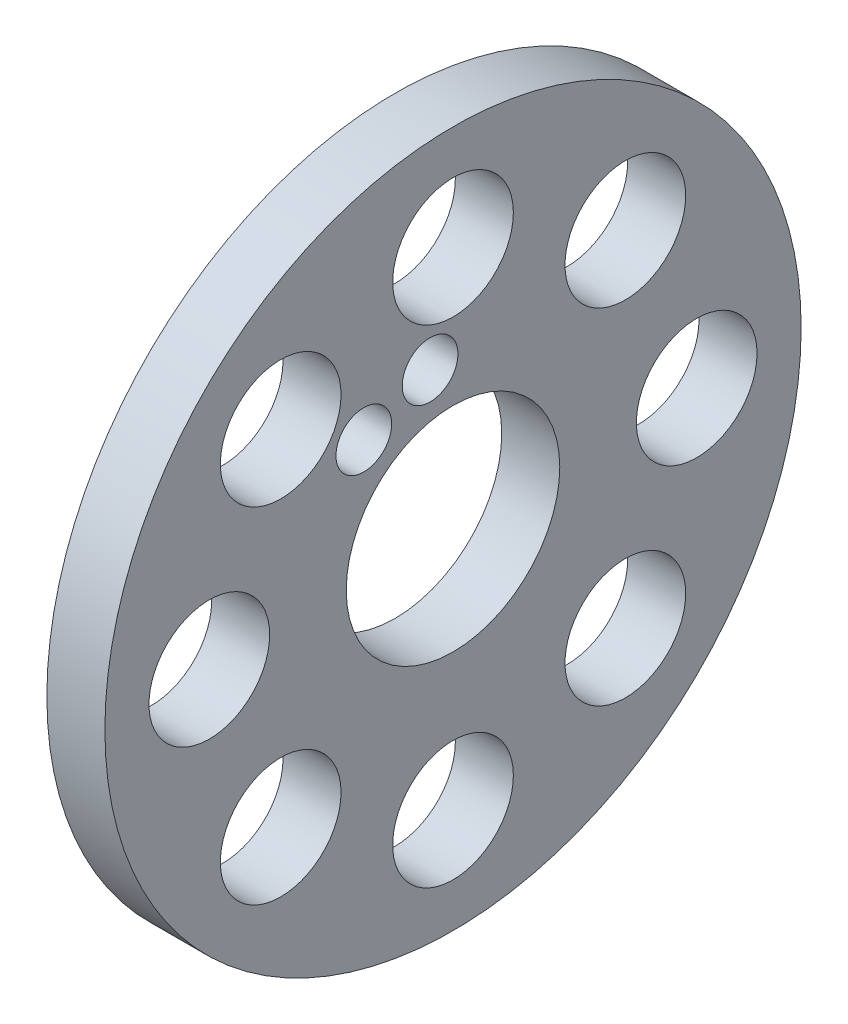
ISO-10303-21;
HEADER;
FILE_DESCRIPTION(('STEP AP214'),'2;1');
FILE_NAME('part.step','',(''),(''),'','','');
FILE_SCHEMA(('AUTOMOTIVE_DESIGN { 1 0 10303 214 1 1 1 1 }'));
ENDSEC;
DATA;
#1=APPLICATION_CONTEXT('core data for automotive mechanical design processes');
#2=APPLICATION_PROTOCOL_DEFINITION('international standard','automotive_design',2000,#1);
#3=PRODUCT_CONTEXT('',#1,'mechanical');
#4=PRODUCT('Part','Part','',(#3));
#5=PRODUCT_RELATED_PRODUCT_CATEGORY('part','',(#4));
#6=PRODUCT_DEFINITION_FORMATION('','',#4);
#7=PRODUCT_DEFINITION_CONTEXT('part definition',#1,'design');
#8=PRODUCT_DEFINITION('design','',#6,#7);
#9=PRODUCT_DEFINITION_SHAPE('','',#8);
#10=(LENGTH_UNIT() NAMED_UNIT(*) SI_UNIT(.MILLI.,.METRE.));
#11=(NAMED_UNIT(*) PLANE_ANGLE_UNIT() SI_UNIT($,.RADIAN.));
#12=(NAMED_UNIT(*) SI_UNIT($,.STERADIAN.) SOLID_ANGLE_UNIT());
#13=UNCERTAINTY_MEASURE_WITH_UNIT(LENGTH_MEASURE(1.E-05),#10,'distance_accuracy_value','');
#14=(GEOMETRIC_REPRESENTATION_CONTEXT(3) GLOBAL_UNCERTAINTY_ASSIGNED_CONTEXT((#13)) GLOBAL_UNIT_ASSIGNED_CONTEXT((#10,
#11,#12)) REPRESENTATION_CONTEXT('',''));
#15=CARTESIAN_POINT('',(0.,0.,0.));
#16=DIRECTION('',(0.,0.,1.));
#17=DIRECTION('',(1.,0.,0.));
#18=AXIS2_PLACEMENT_3D('',#15,#16,#17);
#19=CARTESIAN_POINT('',(143.7,30.,0.));
#20=DIRECTION('',(1.,0.,0.));
#21=DIRECTION('',(0.,0.,-1.));
#22=AXIS2_PLACEMENT_3D('',#19,#20,#21);
#23=PLANE('',#22);
#24=CARTESIAN_POINT('',(143.7,12.8487337040411,1.97738266469541));
#25=DIRECTION('',(1.,0.,0.));
#26=DIRECTION('',(0.,0.,-1.));
#27=AXIS2_PLACEMENT_3D('',#24,#25,#26);
#28=CIRCLE('',#27,2.4);
#29=CARTESIAN_POINT('',(143.7,12.8487337040411,-0.422617335304591));
#30=VERTEX_POINT('',#29);
#31=EDGE_CURVE('E50',#30,#30,#28,.F.);
#32=ORIENTED_EDGE('',*,*,#31,.F.);
#33=EDGE_LOOP('',(#32));
#34=FACE_BOUND('',#33,.T.);
#35=CARTESIAN_POINT('',(143.7,14.8492424049175,-14.8492424049175));
#36=DIRECTION('',(1.,0.,0.));
#37=DIRECTION('',(0.,0.,-1.));
#38=AXIS2_PLACEMENT_3D('',#35,#36,#37);
#39=CIRCLE('',#38,5.2);
#40=CARTESIAN_POINT('',(143.7,14.8492424049175,-20.0492424049175));
#41=VERTEX_POINT('',#40);
#42=EDGE_CURVE('E53',#41,#41,#39,.F.);
#43=ORIENTED_EDGE('',*,*,#42,.F.);
#44=EDGE_LOOP('',(#43));
#45=FACE_BOUND('',#44,.T.);
#46=CARTESIAN_POINT('',(143.7,0.,-21.));
#47=DIRECTION('',(1.,0.,0.));
#48=DIRECTION('',(0.,0.,-1.));
#49=AXIS2_PLACEMENT_3D('',#46,#47,#48);
#50=CIRCLE('',#49,5.2);
#51=CARTESIAN_POINT('',(143.7,0.,-26.2));
#52=VERTEX_POINT('',#51);
#53=EDGE_CURVE('E56',#52,#52,#50,.F.);
#54=ORIENTED_EDGE('',*,*,#53,.F.);
#55=EDGE_LOOP('',(#54));
#56=FACE_BOUND('',#55,.T.);
#57=CARTESIAN_POINT('',(143.7,-14.8492424049175,-14.8492424049175));
#58=DIRECTION('',(1.,0.,0.));
#59=DIRECTION('',(0.,0.,-1.));
#60=AXIS2_PLACEMENT_3D('',#57,#58,#59);
#61=CIRCLE('',#60,5.2);
#62=CARTESIAN_POINT('',(143.7,-14.8492424049175,-20.0492424049175));
#63=VERTEX_POINT('',#62);
#64=EDGE_CURVE('E59',#63,#63,#61,.F.);
#65=ORIENTED_EDGE('',*,*,#64,.F.);
#66=EDGE_LOOP('',(#65));
#67=FACE_BOUND('',#66,.T.);
#68=CARTESIAN_POINT('',(143.7,-21.,0.));
#69=DIRECTION('',(1.,0.,0.));
#70=DIRECTION('',(0.,0.,-1.));
#71=AXIS2_PLACEMENT_3D('',#68,#69,#70);
#72=CIRCLE('',#71,5.2);
#73=CARTESIAN_POINT('',(143.7,-21.,-5.2));
#74=VERTEX_POINT('',#73);
#75=EDGE_CURVE('E62',#74,#74,#72,.F.);
#76=ORIENTED_EDGE('',*,*,#75,.F.);
#77=EDGE_LOOP('',(#76));
#78=FACE_BOUND('',#77,.T.);
#79=CARTESIAN_POINT('',(143.7,-14.8492424049175,14.8492424049175));
#80=DIRECTION('',(1.,0.,0.));
#81=DIRECTION('',(0.,0.,-1.));
#82=AXIS2_PLACEMENT_3D('',#79,#80,#81);
#83=CIRCLE('',#82,5.2);
#84=CARTESIAN_POINT('',(143.7,-14.8492424049175,9.6492424049175));
#85=VERTEX_POINT('',#84);
#86=EDGE_CURVE('E65',#85,#85,#83,.F.);
#87=ORIENTED_EDGE('',*,*,#86,.F.);
#88=EDGE_LOOP('',(#87));
#89=FACE_BOUND('',#88,.T.);
#90=CARTESIAN_POINT('',(143.7,0.,21.));
#91=DIRECTION('',(1.,0.,0.));
#92=DIRECTION('',(0.,0.,-1.));
#93=AXIS2_PLACEMENT_3D('',#90,#91,#92);
#94=CIRCLE('',#93,5.2);
#95=CARTESIAN_POINT('',(143.7,0.,15.8));
#96=VERTEX_POINT('',#95);
#97=EDGE_CURVE('E68',#96,#96,#94,.F.);
#98=ORIENTED_EDGE('',*,*,#97,.F.);
#99=EDGE_LOOP('',(#98));
#100=FACE_BOUND('',#99,.T.);
#101=CARTESIAN_POINT('',(143.7,14.8492424049175,14.8492424049175));
#102=DIRECTION('',(1.,0.,0.));
#103=DIRECTION('',(0.,0.,-1.));
#104=AXIS2_PLACEMENT_3D('',#101,#102,#103);
#105=CIRCLE('',#104,5.2);
#106=CARTESIAN_POINT('',(143.7,14.8492424049175,9.6492424049175));
#107=VERTEX_POINT('',#106);
#108=EDGE_CURVE('E71',#107,#107,#105,.F.);
#109=ORIENTED_EDGE('',*,*,#108,.F.);
#110=EDGE_LOOP('',(#109));
#111=FACE_BOUND('',#110,.T.);
#112=CARTESIAN_POINT('',(143.7,10.4836474229945,7.68720604058077));
#113=DIRECTION('',(1.,0.,0.));
#114=DIRECTION('',(0.,0.,-1.));
#115=AXIS2_PLACEMENT_3D('',#112,#113,#114);
#116=CIRCLE('',#115,2.4);
#117=CARTESIAN_POINT('',(143.7,10.4836474229945,5.28720604058077));
#118=VERTEX_POINT('',#117);
#119=EDGE_CURVE('E74',#118,#118,#116,.F.);
#120=ORIENTED_EDGE('',*,*,#119,.F.);
#121=EDGE_LOOP('',(#120));
#122=FACE_BOUND('',#121,.T.);
#123=CARTESIAN_POINT('',(143.7,21.,0.));
#124=DIRECTION('',(1.,0.,0.));
#125=DIRECTION('',(0.,0.,-1.));
#126=AXIS2_PLACEMENT_3D('',#123,#124,#125);
#127=CIRCLE('',#126,5.2);
#128=CARTESIAN_POINT('',(143.7,21.,-5.2));
#129=VERTEX_POINT('',#128);
#130=EDGE_CURVE('E77',#129,#129,#127,.F.);
#131=ORIENTED_EDGE('',*,*,#130,.F.);
#132=EDGE_LOOP('',(#131));
#133=FACE_BOUND('',#132,.T.);
#134=CARTESIAN_POINT('',(143.7,0.,0.));
#135=DIRECTION('',(-1.,0.,0.));
#136=DIRECTION('',(0.,0.,1.));
#137=AXIS2_PLACEMENT_3D('',#134,#135,#136);
#138=CIRCLE('',#137,9.2);
#139=CARTESIAN_POINT('',(143.7,0.,9.2));
#140=VERTEX_POINT('',#139);
#141=EDGE_CURVE('E10',#140,#140,#138,.T.);
#142=ORIENTED_EDGE('',*,*,#141,.F.);
#143=EDGE_LOOP('',(#142));
#144=FACE_BOUND('',#143,.T.);
#145=CARTESIAN_POINT('',(143.7,0.,0.));
#146=DIRECTION('',(-1.,0.,0.));
#147=DIRECTION('',(0.,0.,1.));
#148=AXIS2_PLACEMENT_3D('',#145,#146,#147);
#149=CIRCLE('',#148,30.);
#150=CARTESIAN_POINT('',(143.7,0.,30.));
#151=VERTEX_POINT('',#150);
#152=EDGE_CURVE('E45',#151,#151,#149,.T.);
#153=ORIENTED_EDGE('',*,*,#152,.T.);
#154=EDGE_LOOP('',(#153));
#155=FACE_BOUND('',#154,.T.);
#156=ADVANCED_FACE('F31',(#34,#45,#56,#67,#78,#89,#100,#111,#122,#133,#144,#155),#23,.F.);
#157=CARTESIAN_POINT('',(-110.,0.,0.));
#158=DIRECTION('',(-1.,0.,0.));
#159=DIRECTION('',(0.,0.,1.));
#160=AXIS2_PLACEMENT_3D('',#157,#158,#159);
#161=CYLINDRICAL_SURFACE('',#160,9.2);
#162=CARTESIAN_POINT('',(148.7,0.,0.));
#163=DIRECTION('',(-1.,0.,0.));
#164=DIRECTION('',(0.,0.,1.));
#165=AXIS2_PLACEMENT_3D('',#162,#163,#164);
#166=CIRCLE('',#165,9.2);
#167=CARTESIAN_POINT('',(148.7,0.,9.2));
#168=VERTEX_POINT('',#167);
#169=EDGE_CURVE('E37',#168,#168,#166,.T.);
#170=ORIENTED_EDGE('',*,*,#169,.F.);
#171=EDGE_LOOP('',(#170));
#172=FACE_BOUND('',#171,.T.);
#173=ORIENTED_EDGE('',*,*,#141,.T.);
#174=EDGE_LOOP('',(#173));
#175=FACE_BOUND('',#174,.T.);
#176=ADVANCED_FACE('F118',(#172,#175),#161,.F.);
#177=CARTESIAN_POINT('',(148.7,9.2,0.));
#178=DIRECTION('',(-1.,0.,0.));
#179=DIRECTION('',(0.,0.,1.));
#180=AXIS2_PLACEMENT_3D('',#177,#178,#179);
#181=PLANE('',#180);
#182=CARTESIAN_POINT('',(148.7,12.8487337040411,1.97738266469541));
#183=DIRECTION('',(1.,0.,0.));
#184=DIRECTION('',(0.,0.,-1.));
#185=AXIS2_PLACEMENT_3D('',#182,#183,#184);
#186=CIRCLE('',#185,2.4);
#187=CARTESIAN_POINT('',(148.7,12.8487337040411,-0.422617335304591));
#188=VERTEX_POINT('',#187);
#189=EDGE_CURVE('E96',#188,#188,#186,.T.);
#190=ORIENTED_EDGE('',*,*,#189,.F.);
#191=EDGE_LOOP('',(#190));
#192=FACE_BOUND('',#191,.T.);
#193=CARTESIAN_POINT('',(148.7,14.8492424049175,-14.8492424049175));
#194=DIRECTION('',(1.,0.,0.));
#195=DIRECTION('',(0.,0.,-1.));
#196=AXIS2_PLACEMENT_3D('',#193,#194,#195);
#197=CIRCLE('',#196,5.2);
#198=CARTESIAN_POINT('',(148.7,14.8492424049175,-20.0492424049175));
#199=VERTEX_POINT('',#198);
#200=EDGE_CURVE('E99',#199,#199,#197,.T.);
#201=ORIENTED_EDGE('',*,*,#200,.F.);
#202=EDGE_LOOP('',(#201));
#203=FACE_BOUND('',#202,.T.);
#204=CARTESIAN_POINT('',(148.7,0.,-21.));
#205=DIRECTION('',(1.,0.,0.));
#206=DIRECTION('',(0.,0.,-1.));
#207=AXIS2_PLACEMENT_3D('',#204,#205,#206);
#208=CIRCLE('',#207,5.2);
#209=CARTESIAN_POINT('',(148.7,0.,-26.2));
#210=VERTEX_POINT('',#209);
#211=EDGE_CURVE('E103',#210,#210,#208,.T.);
#212=ORIENTED_EDGE('',*,*,#211,.F.);
#213=EDGE_LOOP('',(#212));
#214=FACE_BOUND('',#213,.T.);
#215=CARTESIAN_POINT('',(148.7,-14.8492424049175,-14.8492424049175));
#216=DIRECTION('',(1.,0.,0.));
#217=DIRECTION('',(0.,0.,-1.));
#218=AXIS2_PLACEMENT_3D('',#215,#216,#217);
#219=CIRCLE('',#218,5.2);
#220=CARTESIAN_POINT('',(148.7,-14.8492424049175,-20.0492424049175));
#221=VERTEX_POINT('',#220);
#222=EDGE_CURVE('E88',#221,#221,#219,.T.);
#223=ORIENTED_EDGE('',*,*,#222,.F.);
#224=EDGE_LOOP('',(#223));
#225=FACE_BOUND('',#224,.T.);
#226=CARTESIAN_POINT('',(148.7,-21.,0.));
#227=DIRECTION('',(1.,0.,0.));
#228=DIRECTION('',(0.,0.,-1.));
#229=AXIS2_PLACEMENT_3D('',#226,#227,#228);
#230=CIRCLE('',#229,5.2);
#231=CARTESIAN_POINT('',(148.7,-21.,-5.2));
#232=VERTEX_POINT('',#231);
#233=EDGE_CURVE('E84',#232,#232,#230,.T.);
#234=ORIENTED_EDGE('',*,*,#233,.F.);
#235=EDGE_LOOP('',(#234));
#236=FACE_BOUND('',#235,.T.);
#237=CARTESIAN_POINT('',(148.7,-14.8492424049175,14.8492424049175));
#238=DIRECTION('',(1.,0.,0.));
#239=DIRECTION('',(0.,0.,-1.));
#240=AXIS2_PLACEMENT_3D('',#237,#238,#239);
#241=CIRCLE('',#240,5.2);
#242=CARTESIAN_POINT('',(148.7,-14.8492424049175,9.6492424049175));
#243=VERTEX_POINT('',#242);
#244=EDGE_CURVE('E87',#243,#243,#241,.T.);
#245=ORIENTED_EDGE('',*,*,#244,.F.);
#246=EDGE_LOOP('',(#245));
#247=FACE_BOUND('',#246,.T.);
#248=CARTESIAN_POINT('',(148.7,0.,21.));
#249=DIRECTION('',(1.,0.,0.));
#250=DIRECTION('',(0.,0.,-1.));
#251=AXIS2_PLACEMENT_3D('',#248,#249,#250);
#252=CIRCLE('',#251,5.2);
#253=CARTESIAN_POINT('',(148.7,0.,15.8));
#254=VERTEX_POINT('',#253);
#255=EDGE_CURVE('E91',#254,#254,#252,.T.);
#256=ORIENTED_EDGE('',*,*,#255,.F.);
#257=EDGE_LOOP('',(#256));
#258=FACE_BOUND('',#257,.T.);
#259=CARTESIAN_POINT('',(148.7,14.8492424049175,14.8492424049175));
#260=DIRECTION('',(1.,0.,0.));
#261=DIRECTION('',(0.,0.,-1.));
#262=AXIS2_PLACEMENT_3D('',#259,#260,#261);
#263=CIRCLE('',#262,5.2);
#264=CARTESIAN_POINT('',(148.7,14.8492424049175,9.6492424049175));
#265=VERTEX_POINT('',#264);
#266=EDGE_CURVE('E83',#265,#265,#263,.T.);
#267=ORIENTED_EDGE('',*,*,#266,.F.);
#268=EDGE_LOOP('',(#267));
#269=FACE_BOUND('',#268,.T.);
#270=CARTESIAN_POINT('',(148.7,10.4836474229945,7.68720604058077));
#271=DIRECTION('',(1.,0.,0.));
#272=DIRECTION('',(0.,0.,-1.));
#273=AXIS2_PLACEMENT_3D('',#270,#271,#272);
#274=CIRCLE('',#273,2.4);
#275=CARTESIAN_POINT('',(148.7,10.4836474229945,5.28720604058077));
#276=VERTEX_POINT('',#275);
#277=EDGE_CURVE('E100',#276,#276,#274,.T.);
#278=ORIENTED_EDGE('',*,*,#277,.F.);
#279=EDGE_LOOP('',(#278));
#280=FACE_BOUND('',#279,.T.);
#281=CARTESIAN_POINT('',(148.7,21.,0.));
#282=DIRECTION('',(1.,0.,0.));
#283=DIRECTION('',(0.,0.,-1.));
#284=AXIS2_PLACEMENT_3D('',#281,#282,#283);
#285=CIRCLE('',#284,5.2);
#286=CARTESIAN_POINT('',(148.7,21.,-5.2));
#287=VERTEX_POINT('',#286);
#288=EDGE_CURVE('E80',#287,#287,#285,.T.);
#289=ORIENTED_EDGE('',*,*,#288,.F.);
#290=EDGE_LOOP('',(#289));
#291=FACE_BOUND('',#290,.T.);
#292=CARTESIAN_POINT('',(148.7,0.,0.));
#293=DIRECTION('',(-1.,0.,0.));
#294=DIRECTION('',(0.,0.,1.));
#295=AXIS2_PLACEMENT_3D('',#292,#293,#294);
#296=CIRCLE('',#295,30.);
#297=CARTESIAN_POINT('',(148.7,0.,30.));
#298=VERTEX_POINT('',#297);
#299=EDGE_CURVE('E41',#298,#298,#296,.T.);
#300=ORIENTED_EDGE('',*,*,#299,.F.);
#301=EDGE_LOOP('',(#300));
#302=FACE_BOUND('',#301,.T.);
#303=ORIENTED_EDGE('',*,*,#169,.T.);
#304=EDGE_LOOP('',(#303));
#305=FACE_BOUND('',#304,.T.);
#306=ADVANCED_FACE('F114',(#192,#203,#214,#225,#236,#247,#258,#269,#280,#291,#302,#305),#181,.F.);
#307=CARTESIAN_POINT('',(-110.,0.,0.));
#308=DIRECTION('',(-1.,0.,0.));
#309=DIRECTION('',(0.,0.,1.));
#310=AXIS2_PLACEMENT_3D('',#307,#308,#309);
#311=CYLINDRICAL_SURFACE('',#310,30.);
#312=ORIENTED_EDGE('',*,*,#152,.F.);
#313=EDGE_LOOP('',(#312));
#314=FACE_BOUND('',#313,.T.);
#315=ORIENTED_EDGE('',*,*,#299,.T.);
#316=EDGE_LOOP('',(#315));
#317=FACE_BOUND('',#316,.T.);
#318=ADVANCED_FACE('F117',(#314,#317),#311,.T.);
#319=CARTESIAN_POINT('',(143.7,21.,0.));
#320=DIRECTION('',(-1.,0.,0.));
#321=DIRECTION('',(0.,0.,1.));
#322=AXIS2_PLACEMENT_3D('',#319,#320,#321);
#323=CYLINDRICAL_SURFACE('',#322,5.2);
#324=ORIENTED_EDGE('',*,*,#288,.T.);
#325=EDGE_LOOP('',(#324));
#326=FACE_BOUND('',#325,.T.);
#327=ORIENTED_EDGE('',*,*,#130,.T.);
#328=EDGE_LOOP('',(#327));
#329=FACE_BOUND('',#328,.T.);
#330=ADVANCED_FACE('F126',(#326,#329),#323,.F.);
#331=CARTESIAN_POINT('',(143.7,10.4836474229945,7.68720604058077));
#332=DIRECTION('',(-1.,0.,0.));
#333=DIRECTION('',(0.,0.,1.));
#334=AXIS2_PLACEMENT_3D('',#331,#332,#333);
#335=CYLINDRICAL_SURFACE('',#334,2.4);
#336=ORIENTED_EDGE('',*,*,#277,.T.);
#337=EDGE_LOOP('',(#336));
#338=FACE_BOUND('',#337,.T.);
#339=ORIENTED_EDGE('',*,*,#119,.T.);
#340=EDGE_LOOP('',(#339));
#341=FACE_BOUND('',#340,.T.);
#342=ADVANCED_FACE('F111',(#338,#341),#335,.F.);
#343=CARTESIAN_POINT('',(143.7,14.8492424049175,14.8492424049175));
#344=DIRECTION('',(-1.,0.,0.));
#345=DIRECTION('',(0.,0.,1.));
#346=AXIS2_PLACEMENT_3D('',#343,#344,#345);
#347=CYLINDRICAL_SURFACE('',#346,5.2);
#348=ORIENTED_EDGE('',*,*,#266,.T.);
#349=EDGE_LOOP('',(#348));
#350=FACE_BOUND('',#349,.T.);
#351=ORIENTED_EDGE('',*,*,#108,.T.);
#352=EDGE_LOOP('',(#351));
#353=FACE_BOUND('',#352,.T.);
#354=ADVANCED_FACE('F164',(#350,#353),#347,.F.);
#355=CARTESIAN_POINT('',(143.7,0.,21.));
#356=DIRECTION('',(-1.,0.,0.));
#357=DIRECTION('',(0.,0.,1.));
#358=AXIS2_PLACEMENT_3D('',#355,#356,#357);
#359=CYLINDRICAL_SURFACE('',#358,5.2);
#360=ORIENTED_EDGE('',*,*,#255,.T.);
#361=EDGE_LOOP('',(#360));
#362=FACE_BOUND('',#361,.T.);
#363=ORIENTED_EDGE('',*,*,#97,.T.);
#364=EDGE_LOOP('',(#363));
#365=FACE_BOUND('',#364,.T.);
#366=ADVANCED_FACE('F169',(#362,#365),#359,.F.);
#367=CARTESIAN_POINT('',(143.7,-14.8492424049175,14.8492424049175));
#368=DIRECTION('',(-1.,0.,0.));
#369=DIRECTION('',(0.,0.,1.));
#370=AXIS2_PLACEMENT_3D('',#367,#368,#369);
#371=CYLINDRICAL_SURFACE('',#370,5.2);
#372=ORIENTED_EDGE('',*,*,#244,.T.);
#373=EDGE_LOOP('',(#372));
#374=FACE_BOUND('',#373,.T.);
#375=ORIENTED_EDGE('',*,*,#86,.T.);
#376=EDGE_LOOP('',(#375));
#377=FACE_BOUND('',#376,.T.);
#378=ADVANCED_FACE('F192',(#374,#377),#371,.F.);
#379=CARTESIAN_POINT('',(143.7,-21.,0.));
#380=DIRECTION('',(-1.,0.,0.));
#381=DIRECTION('',(0.,0.,1.));
#382=AXIS2_PLACEMENT_3D('',#379,#380,#381);
#383=CYLINDRICAL_SURFACE('',#382,5.2);
#384=ORIENTED_EDGE('',*,*,#233,.T.);
#385=EDGE_LOOP('',(#384));
#386=FACE_BOUND('',#385,.T.);
#387=ORIENTED_EDGE('',*,*,#75,.T.);
#388=EDGE_LOOP('',(#387));
#389=FACE_BOUND('',#388,.T.);
#390=ADVANCED_FACE('F177',(#386,#389),#383,.F.);
#391=CARTESIAN_POINT('',(143.7,-14.8492424049175,-14.8492424049175));
#392=DIRECTION('',(-1.,0.,0.));
#393=DIRECTION('',(0.,0.,1.));
#394=AXIS2_PLACEMENT_3D('',#391,#392,#393);
#395=CYLINDRICAL_SURFACE('',#394,5.2);
#396=ORIENTED_EDGE('',*,*,#222,.T.);
#397=EDGE_LOOP('',(#396));
#398=FACE_BOUND('',#397,.T.);
#399=ORIENTED_EDGE('',*,*,#64,.T.);
#400=EDGE_LOOP('',(#399));
#401=FACE_BOUND('',#400,.T.);
#402=ADVANCED_FACE('F173',(#398,#401),#395,.F.);
#403=CARTESIAN_POINT('',(143.7,0.,-21.));
#404=DIRECTION('',(-1.,0.,0.));
#405=DIRECTION('',(0.,0.,1.));
#406=AXIS2_PLACEMENT_3D('',#403,#404,#405);
#407=CYLINDRICAL_SURFACE('',#406,5.2);
#408=ORIENTED_EDGE('',*,*,#211,.T.);
#409=EDGE_LOOP('',(#408));
#410=FACE_BOUND('',#409,.T.);
#411=ORIENTED_EDGE('',*,*,#53,.T.);
#412=EDGE_LOOP('',(#411));
#413=FACE_BOUND('',#412,.T.);
#414=ADVANCED_FACE('F176',(#410,#413),#407,.F.);
#415=CARTESIAN_POINT('',(143.7,14.8492424049175,-14.8492424049175));
#416=DIRECTION('',(-1.,0.,0.));
#417=DIRECTION('',(0.,0.,1.));
#418=AXIS2_PLACEMENT_3D('',#415,#416,#417);
#419=CYLINDRICAL_SURFACE('',#418,5.2);
#420=ORIENTED_EDGE('',*,*,#200,.T.);
#421=EDGE_LOOP('',(#420));
#422=FACE_BOUND('',#421,.T.);
#423=ORIENTED_EDGE('',*,*,#42,.T.);
#424=EDGE_LOOP('',(#423));
#425=FACE_BOUND('',#424,.T.);
#426=ADVANCED_FACE('F181',(#422,#425),#419,.F.);
#427=CARTESIAN_POINT('',(143.7,12.8487337040411,1.97738266469541));
#428=DIRECTION('',(-1.,0.,0.));
#429=DIRECTION('',(0.,0.,1.));
#430=AXIS2_PLACEMENT_3D('',#427,#428,#429);
#431=CYLINDRICAL_SURFACE('',#430,2.4);
#432=ORIENTED_EDGE('',*,*,#189,.T.);
#433=EDGE_LOOP('',(#432));
#434=FACE_BOUND('',#433,.T.);
#435=ORIENTED_EDGE('',*,*,#31,.T.);
#436=EDGE_LOOP('',(#435));
#437=FACE_BOUND('',#436,.T.);
#438=ADVANCED_FACE('F185',(#434,#437),#431,.F.);
#439=CLOSED_SHELL('',(#156,#176,#306,#318,#330,#342,#354,#366,#378,#390,#402,#414,#426,#438));
#440=MANIFOLD_SOLID_BREP('B2',#439);
#441=ADVANCED_BREP_SHAPE_REPRESENTATION('',(#18,#440),#14);
#442=SHAPE_DEFINITION_REPRESENTATION(#9,#441);
ENDSEC;
END-ISO-10303-21;
